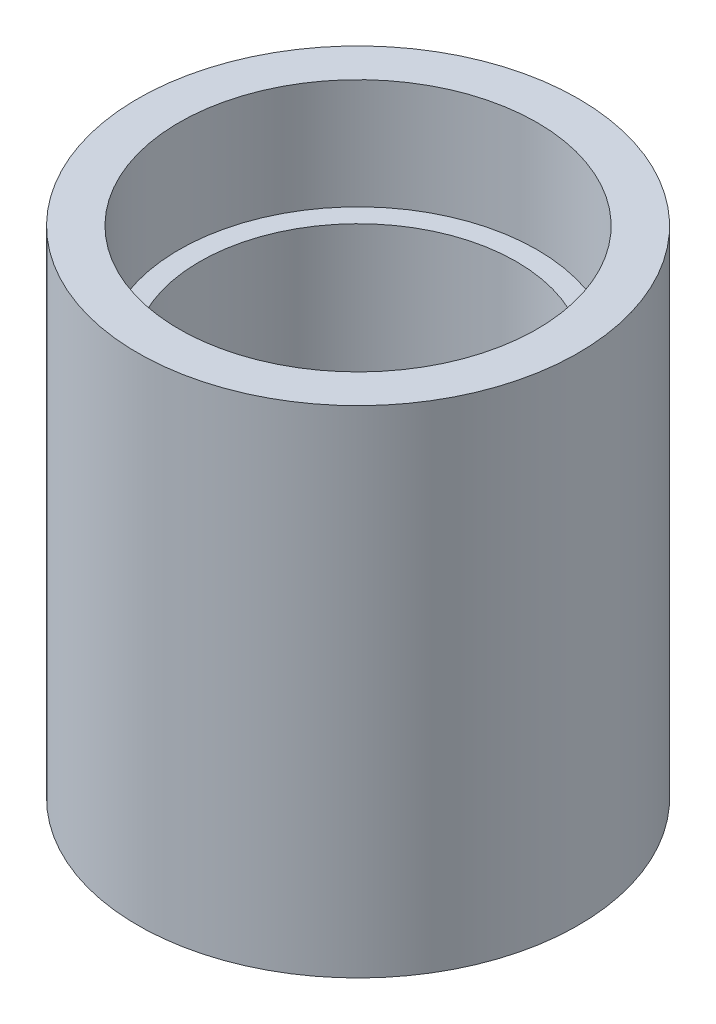
ISO-10303-21;
HEADER;
FILE_DESCRIPTION(('STEP AP214'),'2;1');
FILE_NAME('part.step','',(''),(''),'','','');
FILE_SCHEMA(('AUTOMOTIVE_DESIGN { 1 0 10303 214 1 1 1 1 }'));
ENDSEC;
DATA;
#1=APPLICATION_CONTEXT('core data for automotive mechanical design processes');
#2=APPLICATION_PROTOCOL_DEFINITION('international standard','automotive_design',2000,#1);
#3=PRODUCT_CONTEXT('',#1,'mechanical');
#4=PRODUCT('Part','Part','',(#3));
#5=PRODUCT_RELATED_PRODUCT_CATEGORY('part','',(#4));
#6=PRODUCT_DEFINITION_FORMATION('','',#4);
#7=PRODUCT_DEFINITION_CONTEXT('part definition',#1,'design');
#8=PRODUCT_DEFINITION('design','',#6,#7);
#9=PRODUCT_DEFINITION_SHAPE('','',#8);
#10=(LENGTH_UNIT() NAMED_UNIT(*) SI_UNIT(.MILLI.,.METRE.));
#11=(NAMED_UNIT(*) PLANE_ANGLE_UNIT() SI_UNIT($,.RADIAN.));
#12=(NAMED_UNIT(*) SI_UNIT($,.STERADIAN.) SOLID_ANGLE_UNIT());
#13=UNCERTAINTY_MEASURE_WITH_UNIT(LENGTH_MEASURE(1.E-05),#10,'distance_accuracy_value','');
#14=(GEOMETRIC_REPRESENTATION_CONTEXT(3) GLOBAL_UNCERTAINTY_ASSIGNED_CONTEXT((#13)) GLOBAL_UNIT_ASSIGNED_CONTEXT((#10,
#11,#12)) REPRESENTATION_CONTEXT('',''));
#15=CARTESIAN_POINT('',(0.,0.,0.));
#16=DIRECTION('',(0.,0.,1.));
#17=DIRECTION('',(1.,0.,0.));
#18=AXIS2_PLACEMENT_3D('',#15,#16,#17);
#19=CARTESIAN_POINT('',(0.,0.,0.));
#20=DIRECTION('',(0.,-1.,0.));
#21=DIRECTION('',(0.,0.,-1.));
#22=AXIS2_PLACEMENT_3D('',#19,#20,#21);
#23=CYLINDRICAL_SURFACE('',#22,16.);
#24=CARTESIAN_POINT('',(0.,31.9895095870069,0.));
#25=DIRECTION('',(0.,-1.,0.));
#26=DIRECTION('',(0.,0.,-1.));
#27=AXIS2_PLACEMENT_3D('',#24,#25,#26);
#28=CIRCLE('',#27,16.);
#29=CARTESIAN_POINT('',(0.,31.9895095870069,-16.));
#30=VERTEX_POINT('',#29);
#31=EDGE_CURVE('E10',#30,#30,#28,.T.);
#32=ORIENTED_EDGE('',*,*,#31,.F.);
#33=EDGE_LOOP('',(#32));
#34=FACE_BOUND('',#33,.T.);
#35=CARTESIAN_POINT('',(0.,67.9895095870069,0.));
#36=DIRECTION('',(0.,-1.,0.));
#37=DIRECTION('',(0.,0.,-1.));
#38=AXIS2_PLACEMENT_3D('',#35,#36,#37);
#39=CIRCLE('',#38,16.);
#40=CARTESIAN_POINT('',(0.,67.9895095870069,-16.));
#41=VERTEX_POINT('',#40);
#42=EDGE_CURVE('E60',#41,#41,#39,.T.);
#43=ORIENTED_EDGE('',*,*,#42,.T.);
#44=EDGE_LOOP('',(#43));
#45=FACE_BOUND('',#44,.T.);
#46=ADVANCED_FACE('F32',(#34,#45),#23,.T.);
#47=CARTESIAN_POINT('',(-16.,31.9895095870069,0.));
#48=DIRECTION('',(0.,1.,0.));
#49=DIRECTION('',(0.,0.,1.));
#50=AXIS2_PLACEMENT_3D('',#47,#48,#49);
#51=PLANE('',#50);
#52=CARTESIAN_POINT('',(0.,31.9895095870069,0.));
#53=DIRECTION('',(0.,-1.,0.));
#54=DIRECTION('',(0.,0.,-1.));
#55=AXIS2_PLACEMENT_3D('',#52,#53,#54);
#56=CIRCLE('',#55,13.);
#57=CARTESIAN_POINT('',(0.,31.9895095870069,-13.));
#58=VERTEX_POINT('',#57);
#59=EDGE_CURVE('E38',#58,#58,#56,.T.);
#60=ORIENTED_EDGE('',*,*,#59,.F.);
#61=EDGE_LOOP('',(#60));
#62=FACE_BOUND('',#61,.T.);
#63=ORIENTED_EDGE('',*,*,#31,.T.);
#64=EDGE_LOOP('',(#63));
#65=FACE_BOUND('',#64,.T.);
#66=ADVANCED_FACE('F97',(#62,#65),#51,.F.);
#67=CARTESIAN_POINT('',(0.,0.,0.));
#68=DIRECTION('',(0.,-1.,0.));
#69=DIRECTION('',(0.,0.,-1.));
#70=AXIS2_PLACEMENT_3D('',#67,#68,#69);
#71=CYLINDRICAL_SURFACE('',#70,13.);
#72=CARTESIAN_POINT('',(0.,39.9895095870069,0.));
#73=DIRECTION('',(0.,-1.,0.));
#74=DIRECTION('',(0.,0.,-1.));
#75=AXIS2_PLACEMENT_3D('',#72,#73,#74);
#76=CIRCLE('',#75,13.);
#77=CARTESIAN_POINT('',(0.,39.9895095870069,-13.));
#78=VERTEX_POINT('',#77);
#79=EDGE_CURVE('E42',#78,#78,#76,.T.);
#80=ORIENTED_EDGE('',*,*,#79,.F.);
#81=EDGE_LOOP('',(#80));
#82=FACE_BOUND('',#81,.T.);
#83=ORIENTED_EDGE('',*,*,#59,.T.);
#84=EDGE_LOOP('',(#83));
#85=FACE_BOUND('',#84,.T.);
#86=ADVANCED_FACE('F92',(#82,#85),#71,.F.);
#87=CARTESIAN_POINT('',(-13.,39.9895095870069,0.));
#88=DIRECTION('',(0.,1.,0.));
#89=DIRECTION('',(0.,0.,1.));
#90=AXIS2_PLACEMENT_3D('',#87,#88,#89);
#91=PLANE('',#90);
#92=CARTESIAN_POINT('',(0.,39.9895095870069,0.));
#93=DIRECTION('',(0.,-1.,0.));
#94=DIRECTION('',(0.,0.,-1.));
#95=AXIS2_PLACEMENT_3D('',#92,#93,#94);
#96=CIRCLE('',#95,11.5);
#97=CARTESIAN_POINT('',(0.,39.9895095870069,-11.5));
#98=VERTEX_POINT('',#97);
#99=EDGE_CURVE('E46',#98,#98,#96,.T.);
#100=ORIENTED_EDGE('',*,*,#99,.F.);
#101=EDGE_LOOP('',(#100));
#102=FACE_BOUND('',#101,.T.);
#103=ORIENTED_EDGE('',*,*,#79,.T.);
#104=EDGE_LOOP('',(#103));
#105=FACE_BOUND('',#104,.T.);
#106=ADVANCED_FACE('F86',(#102,#105),#91,.F.);
#107=CARTESIAN_POINT('',(0.,0.,0.));
#108=DIRECTION('',(0.,-1.,0.));
#109=DIRECTION('',(0.,0.,-1.));
#110=AXIS2_PLACEMENT_3D('',#107,#108,#109);
#111=CYLINDRICAL_SURFACE('',#110,11.5);
#112=CARTESIAN_POINT('',(0.,59.9895095870069,0.));
#113=DIRECTION('',(0.,-1.,0.));
#114=DIRECTION('',(0.,0.,-1.));
#115=AXIS2_PLACEMENT_3D('',#112,#113,#114);
#116=CIRCLE('',#115,11.5);
#117=CARTESIAN_POINT('',(0.,59.9895095870069,-11.5));
#118=VERTEX_POINT('',#117);
#119=EDGE_CURVE('E51',#118,#118,#116,.T.);
#120=ORIENTED_EDGE('',*,*,#119,.F.);
#121=EDGE_LOOP('',(#120));
#122=FACE_BOUND('',#121,.T.);
#123=ORIENTED_EDGE('',*,*,#99,.T.);
#124=EDGE_LOOP('',(#123));
#125=FACE_BOUND('',#124,.T.);
#126=ADVANCED_FACE('F80',(#122,#125),#111,.F.);
#127=CARTESIAN_POINT('',(-11.5,59.9895095870069,0.));
#128=DIRECTION('',(0.,-1.,0.));
#129=DIRECTION('',(0.,0.,-1.));
#130=AXIS2_PLACEMENT_3D('',#127,#128,#129);
#131=PLANE('',#130);
#132=CARTESIAN_POINT('',(0.,59.9895095870069,0.));
#133=DIRECTION('',(0.,-1.,0.));
#134=DIRECTION('',(0.,0.,-1.));
#135=AXIS2_PLACEMENT_3D('',#132,#133,#134);
#136=CIRCLE('',#135,13.);
#137=CARTESIAN_POINT('',(0.,59.9895095870069,-13.));
#138=VERTEX_POINT('',#137);
#139=EDGE_CURVE('E54',#138,#138,#136,.T.);
#140=ORIENTED_EDGE('',*,*,#139,.F.);
#141=EDGE_LOOP('',(#140));
#142=FACE_BOUND('',#141,.T.);
#143=ORIENTED_EDGE('',*,*,#119,.T.);
#144=EDGE_LOOP('',(#143));
#145=FACE_BOUND('',#144,.T.);
#146=ADVANCED_FACE('F74',(#142,#145),#131,.F.);
#147=CARTESIAN_POINT('',(0.,0.,0.));
#148=DIRECTION('',(0.,-1.,0.));
#149=DIRECTION('',(0.,0.,-1.));
#150=AXIS2_PLACEMENT_3D('',#147,#148,#149);
#151=CYLINDRICAL_SURFACE('',#150,13.);
#152=CARTESIAN_POINT('',(0.,67.9895095870069,0.));
#153=DIRECTION('',(0.,-1.,0.));
#154=DIRECTION('',(0.,0.,-1.));
#155=AXIS2_PLACEMENT_3D('',#152,#153,#154);
#156=CIRCLE('',#155,13.);
#157=CARTESIAN_POINT('',(0.,67.9895095870069,-13.));
#158=VERTEX_POINT('',#157);
#159=EDGE_CURVE('E57',#158,#158,#156,.T.);
#160=ORIENTED_EDGE('',*,*,#159,.F.);
#161=EDGE_LOOP('',(#160));
#162=FACE_BOUND('',#161,.T.);
#163=ORIENTED_EDGE('',*,*,#139,.T.);
#164=EDGE_LOOP('',(#163));
#165=FACE_BOUND('',#164,.T.);
#166=ADVANCED_FACE('F68',(#162,#165),#151,.F.);
#167=CARTESIAN_POINT('',(-13.,67.9895095870069,0.));
#168=DIRECTION('',(0.,-1.,0.));
#169=DIRECTION('',(0.,0.,-1.));
#170=AXIS2_PLACEMENT_3D('',#167,#168,#169);
#171=PLANE('',#170);
#172=ORIENTED_EDGE('',*,*,#42,.F.);
#173=EDGE_LOOP('',(#172));
#174=FACE_BOUND('',#173,.T.);
#175=ORIENTED_EDGE('',*,*,#159,.T.);
#176=EDGE_LOOP('',(#175));
#177=FACE_BOUND('',#176,.T.);
#178=ADVANCED_FACE('F65',(#174,#177),#171,.F.);
#179=CLOSED_SHELL('',(#46,#66,#86,#106,#126,#146,#166,#178));
#180=MANIFOLD_SOLID_BREP('B2',#179);
#181=ADVANCED_BREP_SHAPE_REPRESENTATION('',(#18,#180),#14);
#182=SHAPE_DEFINITION_REPRESENTATION(#9,#181);
ENDSEC;
END-ISO-10303-21;
